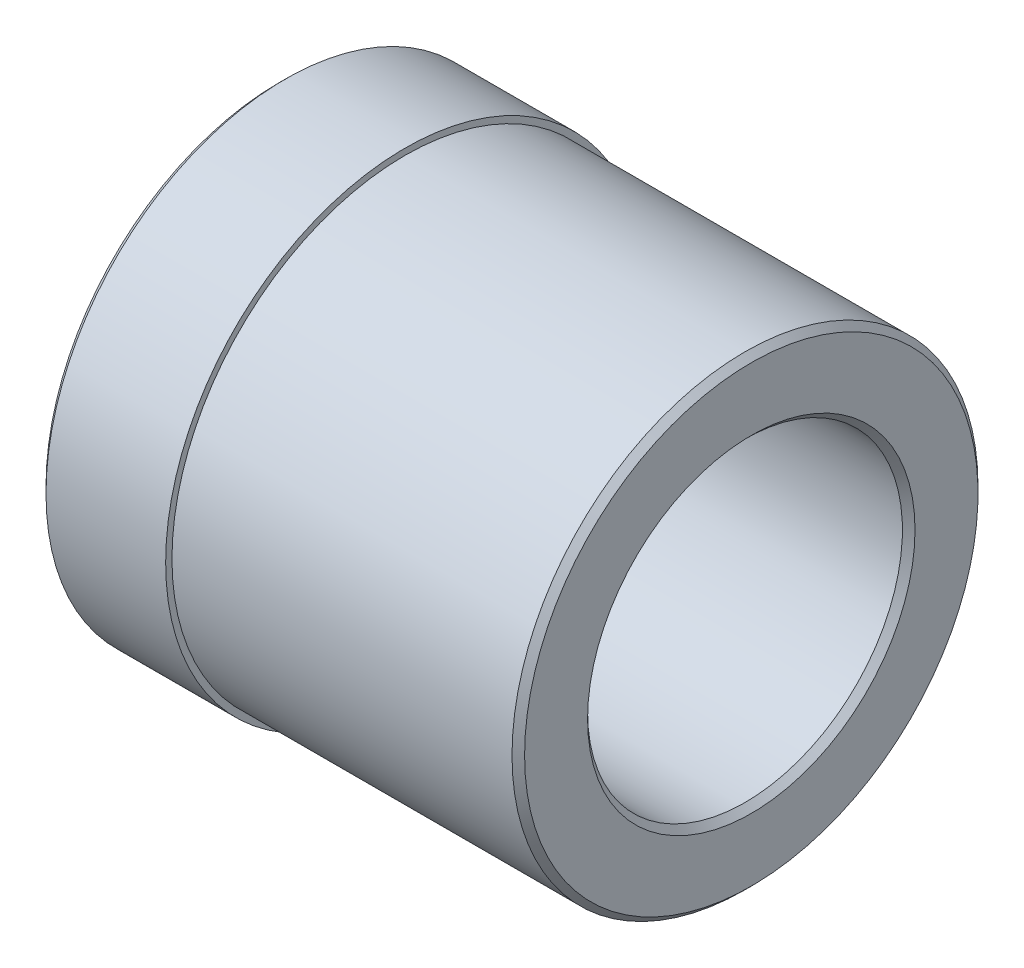
ISO-10303-21;
HEADER;
FILE_DESCRIPTION(('STEP AP214'),'2;1');
FILE_NAME('part.step','',(''),(''),'','','');
FILE_SCHEMA(('AUTOMOTIVE_DESIGN { 1 0 10303 214 1 1 1 1 }'));
ENDSEC;
DATA;
#1=APPLICATION_CONTEXT('core data for automotive mechanical design processes');
#2=APPLICATION_PROTOCOL_DEFINITION('international standard','automotive_design',2000,#1);
#3=PRODUCT_CONTEXT('',#1,'mechanical');
#4=PRODUCT('Part','Part','',(#3));
#5=PRODUCT_RELATED_PRODUCT_CATEGORY('part','',(#4));
#6=PRODUCT_DEFINITION_FORMATION('','',#4);
#7=PRODUCT_DEFINITION_CONTEXT('part definition',#1,'design');
#8=PRODUCT_DEFINITION('design','',#6,#7);
#9=PRODUCT_DEFINITION_SHAPE('','',#8);
#10=(LENGTH_UNIT() NAMED_UNIT(*) SI_UNIT(.MILLI.,.METRE.));
#11=(NAMED_UNIT(*) PLANE_ANGLE_UNIT() SI_UNIT($,.RADIAN.));
#12=(NAMED_UNIT(*) SI_UNIT($,.STERADIAN.) SOLID_ANGLE_UNIT());
#13=UNCERTAINTY_MEASURE_WITH_UNIT(LENGTH_MEASURE(1.E-05),#10,'distance_accuracy_value','');
#14=(GEOMETRIC_REPRESENTATION_CONTEXT(3) GLOBAL_UNCERTAINTY_ASSIGNED_CONTEXT((#13)) GLOBAL_UNIT_ASSIGNED_CONTEXT((#10,
#11,#12)) REPRESENTATION_CONTEXT('',''));
#15=CARTESIAN_POINT('',(0.,0.,0.));
#16=DIRECTION('',(0.,0.,1.));
#17=DIRECTION('',(1.,0.,0.));
#18=AXIS2_PLACEMENT_3D('',#15,#16,#17);
#19=CARTESIAN_POINT('',(0.,0.,0.));
#20=DIRECTION('',(-1.,0.,0.));
#21=DIRECTION('',(0.,0.,1.));
#22=AXIS2_PLACEMENT_3D('',#19,#20,#21);
#23=CYLINDRICAL_SURFACE('',#22,25.);
#24=CARTESIAN_POINT('',(1.00000000000002,0.,0.));
#25=DIRECTION('',(1.,0.,0.));
#26=DIRECTION('',(0.,0.,-1.));
#27=AXIS2_PLACEMENT_3D('',#24,#25,#26);
#28=CIRCLE('',#27,25.);
#29=CARTESIAN_POINT('',(1.00000000000002,0.,-25.));
#30=VERTEX_POINT('',#29);
#31=EDGE_CURVE('E58',#30,#30,#28,.F.);
#32=ORIENTED_EDGE('',*,*,#31,.T.);
#33=EDGE_LOOP('',(#32));
#34=FACE_BOUND('',#33,.T.);
#35=CARTESIAN_POINT('',(74.,0.,0.));
#36=DIRECTION('',(-1.,0.,0.));
#37=DIRECTION('',(0.,0.,1.));
#38=AXIS2_PLACEMENT_3D('',#35,#36,#37);
#39=CIRCLE('',#38,25.);
#40=CARTESIAN_POINT('',(74.,0.,25.));
#41=VERTEX_POINT('',#40);
#42=EDGE_CURVE('E61',#41,#41,#39,.F.);
#43=ORIENTED_EDGE('',*,*,#42,.T.);
#44=EDGE_LOOP('',(#43));
#45=FACE_BOUND('',#44,.T.);
#46=ADVANCED_FACE('F32',(#34,#45),#23,.F.);
#47=CARTESIAN_POINT('',(0.,25.,0.));
#48=DIRECTION('',(1.,0.,0.));
#49=DIRECTION('',(0.,0.,-1.));
#50=AXIS2_PLACEMENT_3D('',#47,#48,#49);
#51=PLANE('',#50);
#52=CARTESIAN_POINT('',(0.,0.,0.));
#53=DIRECTION('',(1.,0.,0.));
#54=DIRECTION('',(0.,0.,-1.));
#55=AXIS2_PLACEMENT_3D('',#52,#53,#54);
#56=CIRCLE('',#55,26.);
#57=CARTESIAN_POINT('',(0.,0.,-26.));
#58=VERTEX_POINT('',#57);
#59=EDGE_CURVE('E52',#58,#58,#56,.T.);
#60=ORIENTED_EDGE('',*,*,#59,.T.);
#61=EDGE_LOOP('',(#60));
#62=FACE_BOUND('',#61,.T.);
#63=CARTESIAN_POINT('',(0.,0.,0.));
#64=DIRECTION('',(1.,0.,0.));
#65=DIRECTION('',(0.,0.,-1.));
#66=AXIS2_PLACEMENT_3D('',#63,#64,#65);
#67=CIRCLE('',#66,37.);
#68=CARTESIAN_POINT('',(0.,0.,-37.));
#69=VERTEX_POINT('',#68);
#70=EDGE_CURVE('E55',#69,#69,#67,.F.);
#71=ORIENTED_EDGE('',*,*,#70,.T.);
#72=EDGE_LOOP('',(#71));
#73=FACE_BOUND('',#72,.T.);
#74=ADVANCED_FACE('F87',(#62,#73),#51,.F.);
#75=CARTESIAN_POINT('',(0.,0.,0.));
#76=DIRECTION('',(-1.,0.,0.));
#77=DIRECTION('',(0.,0.,1.));
#78=AXIS2_PLACEMENT_3D('',#75,#76,#77);
#79=CYLINDRICAL_SURFACE('',#78,38.);
#80=CARTESIAN_POINT('',(1.,0.,0.));
#81=DIRECTION('',(1.,0.,0.));
#82=DIRECTION('',(0.,0.,-1.));
#83=AXIS2_PLACEMENT_3D('',#80,#81,#82);
#84=CIRCLE('',#83,38.);
#85=CARTESIAN_POINT('',(1.,0.,-38.));
#86=VERTEX_POINT('',#85);
#87=EDGE_CURVE('E47',#86,#86,#84,.T.);
#88=ORIENTED_EDGE('',*,*,#87,.T.);
#89=EDGE_LOOP('',(#88));
#90=FACE_BOUND('',#89,.T.);
#91=CARTESIAN_POINT('',(20.,0.,0.));
#92=DIRECTION('',(-1.,0.,0.));
#93=DIRECTION('',(0.,0.,1.));
#94=AXIS2_PLACEMENT_3D('',#91,#92,#93);
#95=CIRCLE('',#94,38.);
#96=CARTESIAN_POINT('',(20.,0.,38.));
#97=VERTEX_POINT('',#96);
#98=EDGE_CURVE('E64',#97,#97,#95,.T.);
#99=ORIENTED_EDGE('',*,*,#98,.T.);
#100=EDGE_LOOP('',(#99));
#101=FACE_BOUND('',#100,.T.);
#102=ADVANCED_FACE('F83',(#90,#101),#79,.T.);
#103=CARTESIAN_POINT('',(20.,38.,0.));
#104=DIRECTION('',(-1.,0.,0.));
#105=DIRECTION('',(0.,0.,1.));
#106=AXIS2_PLACEMENT_3D('',#103,#104,#105);
#107=PLANE('',#106);
#108=ORIENTED_EDGE('',*,*,#98,.F.);
#109=EDGE_LOOP('',(#108));
#110=FACE_BOUND('',#109,.T.);
#111=CARTESIAN_POINT('',(20.,0.,0.));
#112=DIRECTION('',(-1.,0.,0.));
#113=DIRECTION('',(0.,0.,1.));
#114=AXIS2_PLACEMENT_3D('',#111,#112,#113);
#115=CIRCLE('',#114,37.);
#116=CARTESIAN_POINT('',(20.,0.,37.));
#117=VERTEX_POINT('',#116);
#118=EDGE_CURVE('E67',#117,#117,#115,.T.);
#119=ORIENTED_EDGE('',*,*,#118,.T.);
#120=EDGE_LOOP('',(#119));
#121=FACE_BOUND('',#120,.T.);
#122=ADVANCED_FACE('F71',(#110,#121),#107,.F.);
#123=CARTESIAN_POINT('',(0.,0.,0.));
#124=DIRECTION('',(-1.,0.,0.));
#125=DIRECTION('',(0.,0.,1.));
#126=AXIS2_PLACEMENT_3D('',#123,#124,#125);
#127=CYLINDRICAL_SURFACE('',#126,37.);
#128=CARTESIAN_POINT('',(74.,0.,0.));
#129=DIRECTION('',(-1.,0.,0.));
#130=DIRECTION('',(0.,0.,1.));
#131=AXIS2_PLACEMENT_3D('',#128,#129,#130);
#132=CIRCLE('',#131,37.);
#133=CARTESIAN_POINT('',(74.,0.,37.));
#134=VERTEX_POINT('',#133);
#135=EDGE_CURVE('E10',#134,#134,#132,.T.);
#136=ORIENTED_EDGE('',*,*,#135,.T.);
#137=EDGE_LOOP('',(#136));
#138=FACE_BOUND('',#137,.T.);
#139=ORIENTED_EDGE('',*,*,#118,.F.);
#140=EDGE_LOOP('',(#139));
#141=FACE_BOUND('',#140,.T.);
#142=ADVANCED_FACE('F73',(#138,#141),#127,.T.);
#143=CARTESIAN_POINT('',(75.,37.,0.));
#144=DIRECTION('',(-1.,0.,0.));
#145=DIRECTION('',(0.,0.,1.));
#146=AXIS2_PLACEMENT_3D('',#143,#144,#145);
#147=PLANE('',#146);
#148=CARTESIAN_POINT('',(75.,0.,0.));
#149=DIRECTION('',(-1.,0.,0.));
#150=DIRECTION('',(0.,0.,1.));
#151=AXIS2_PLACEMENT_3D('',#148,#149,#150);
#152=CIRCLE('',#151,26.);
#153=CARTESIAN_POINT('',(75.,0.,26.));
#154=VERTEX_POINT('',#153);
#155=EDGE_CURVE('E39',#154,#154,#152,.T.);
#156=ORIENTED_EDGE('',*,*,#155,.T.);
#157=EDGE_LOOP('',(#156));
#158=FACE_BOUND('',#157,.T.);
#159=CARTESIAN_POINT('',(75.,0.,0.));
#160=DIRECTION('',(-1.,0.,0.));
#161=DIRECTION('',(0.,0.,1.));
#162=AXIS2_PLACEMENT_3D('',#159,#160,#161);
#163=CIRCLE('',#162,36.);
#164=CARTESIAN_POINT('',(75.,0.,36.));
#165=VERTEX_POINT('',#164);
#166=EDGE_CURVE('E43',#165,#165,#163,.F.);
#167=ORIENTED_EDGE('',*,*,#166,.T.);
#168=EDGE_LOOP('',(#167));
#169=FACE_BOUND('',#168,.T.);
#170=ADVANCED_FACE('F75',(#158,#169),#147,.F.);
#171=CARTESIAN_POINT('',(1.00000000000002,0.,0.));
#172=DIRECTION('',(-1.,0.,0.));
#173=DIRECTION('',(0.,0.,1.));
#174=AXIS2_PLACEMENT_3D('',#171,#172,#173);
#175=CONICAL_SURFACE('',#174,25.,0.785398163397447);
#176=ORIENTED_EDGE('',*,*,#59,.F.);
#177=EDGE_LOOP('',(#176));
#178=FACE_BOUND('',#177,.T.);
#179=ORIENTED_EDGE('',*,*,#31,.F.);
#180=EDGE_LOOP('',(#179));
#181=FACE_BOUND('',#180,.T.);
#182=ADVANCED_FACE('F81',(#178,#181),#175,.F.);
#183=CARTESIAN_POINT('',(0.,0.,0.));
#184=DIRECTION('',(1.,0.,0.));
#185=DIRECTION('',(0.,0.,-1.));
#186=AXIS2_PLACEMENT_3D('',#183,#184,#185);
#187=CONICAL_SURFACE('',#186,37.,0.785398163397445);
#188=ORIENTED_EDGE('',*,*,#87,.F.);
#189=EDGE_LOOP('',(#188));
#190=FACE_BOUND('',#189,.T.);
#191=ORIENTED_EDGE('',*,*,#70,.F.);
#192=EDGE_LOOP('',(#191));
#193=FACE_BOUND('',#192,.T.);
#194=ADVANCED_FACE('F100',(#190,#193),#187,.T.);
#195=CARTESIAN_POINT('',(75.,0.,0.));
#196=DIRECTION('',(1.,0.,0.));
#197=DIRECTION('',(0.,0.,-1.));
#198=AXIS2_PLACEMENT_3D('',#195,#196,#197);
#199=CONICAL_SURFACE('',#198,26.,0.785398163397447);
#200=ORIENTED_EDGE('',*,*,#42,.F.);
#201=EDGE_LOOP('',(#200));
#202=FACE_BOUND('',#201,.T.);
#203=ORIENTED_EDGE('',*,*,#155,.F.);
#204=EDGE_LOOP('',(#203));
#205=FACE_BOUND('',#204,.T.);
#206=ADVANCED_FACE('F103',(#202,#205),#199,.F.);
#207=CARTESIAN_POINT('',(74.,0.,0.));
#208=DIRECTION('',(-1.,0.,0.));
#209=DIRECTION('',(0.,0.,1.));
#210=AXIS2_PLACEMENT_3D('',#207,#208,#209);
#211=CONICAL_SURFACE('',#210,37.,0.785398163397448);
#212=ORIENTED_EDGE('',*,*,#166,.F.);
#213=EDGE_LOOP('',(#212));
#214=FACE_BOUND('',#213,.T.);
#215=ORIENTED_EDGE('',*,*,#135,.F.);
#216=EDGE_LOOP('',(#215));
#217=FACE_BOUND('',#216,.T.);
#218=ADVANCED_FACE('F34',(#214,#217),#211,.T.);
#219=CLOSED_SHELL('',(#46,#74,#102,#122,#142,#170,#182,#194,#206,#218));
#220=MANIFOLD_SOLID_BREP('B2',#219);
#221=ADVANCED_BREP_SHAPE_REPRESENTATION('',(#18,#220),#14);
#222=SHAPE_DEFINITION_REPRESENTATION(#9,#221);
ENDSEC;
END-ISO-10303-21;
